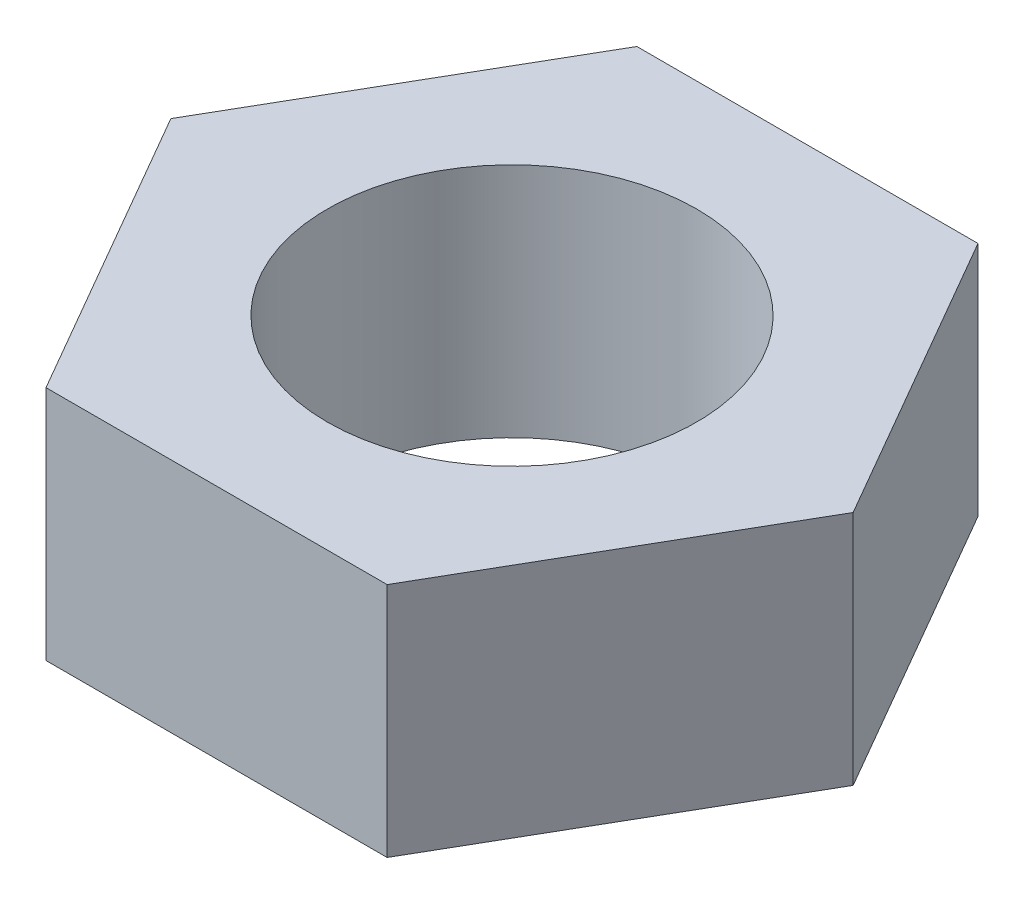
ISO-10303-21;
HEADER;
FILE_DESCRIPTION(('STEP AP214'),'2;1');
FILE_NAME('part.step','',(''),(''),'','','');
FILE_SCHEMA(('AUTOMOTIVE_DESIGN { 1 0 10303 214 1 1 1 1 }'));
ENDSEC;
DATA;
#1=APPLICATION_CONTEXT('core data for automotive mechanical design processes');
#2=APPLICATION_PROTOCOL_DEFINITION('international standard','automotive_design',2000,#1);
#3=PRODUCT_CONTEXT('',#1,'mechanical');
#4=PRODUCT('Part','Part','',(#3));
#5=PRODUCT_RELATED_PRODUCT_CATEGORY('part','',(#4));
#6=PRODUCT_DEFINITION_FORMATION('','',#4);
#7=PRODUCT_DEFINITION_CONTEXT('part definition',#1,'design');
#8=PRODUCT_DEFINITION('design','',#6,#7);
#9=PRODUCT_DEFINITION_SHAPE('','',#8);
#10=(LENGTH_UNIT() NAMED_UNIT(*) SI_UNIT(.MILLI.,.METRE.));
#11=(NAMED_UNIT(*) PLANE_ANGLE_UNIT() SI_UNIT($,.RADIAN.));
#12=(NAMED_UNIT(*) SI_UNIT($,.STERADIAN.) SOLID_ANGLE_UNIT());
#13=UNCERTAINTY_MEASURE_WITH_UNIT(LENGTH_MEASURE(1.E-05),#10,'distance_accuracy_value','');
#14=(GEOMETRIC_REPRESENTATION_CONTEXT(3) GLOBAL_UNCERTAINTY_ASSIGNED_CONTEXT((#13)) GLOBAL_UNIT_ASSIGNED_CONTEXT((#10,
#11,#12)) REPRESENTATION_CONTEXT('',''));
#15=CARTESIAN_POINT('',(0.,0.,0.));
#16=DIRECTION('',(0.,0.,1.));
#17=DIRECTION('',(1.,0.,0.));
#18=AXIS2_PLACEMENT_3D('',#15,#16,#17);
#19=CARTESIAN_POINT('',(-1.15470053837925,1.6,-2.));
#20=DIRECTION('',(0.866025403784439,0.,0.5));
#21=DIRECTION('',(0.5,0.,-0.866025403784439));
#22=AXIS2_PLACEMENT_3D('',#19,#20,#21);
#23=PLANE('',#22);
#24=DIRECTION('',(-0.5,0.,0.866025403784439));
#25=VECTOR('',#24,1.);
#26=CARTESIAN_POINT('',(-1.15470053837925,0.,-2.));
#27=LINE('',#26,#25);
#28=CARTESIAN_POINT('',(-1.15470053837925,0.,-2.));
#29=VERTEX_POINT('',#28);
#30=CARTESIAN_POINT('',(-2.3094010767585,0.,0.));
#31=VERTEX_POINT('',#30);
#32=EDGE_CURVE('E122',#29,#31,#27,.T.);
#33=ORIENTED_EDGE('',*,*,#32,.T.);
#34=DIRECTION('',(0.,-1.,0.));
#35=VECTOR('',#34,1.);
#36=CARTESIAN_POINT('',(-2.3094010767585,1.6,0.));
#37=LINE('',#36,#35);
#38=CARTESIAN_POINT('',(-2.3094010767585,1.6,0.));
#39=VERTEX_POINT('',#38);
#40=EDGE_CURVE('E11',#39,#31,#37,.T.);
#41=ORIENTED_EDGE('',*,*,#40,.F.);
#42=DIRECTION('',(-0.5,0.,0.866025403784439));
#43=VECTOR('',#42,1.);
#44=CARTESIAN_POINT('',(-1.15470053837925,1.6,-2.));
#45=LINE('',#44,#43);
#46=CARTESIAN_POINT('',(-1.15470053837925,1.6,-2.));
#47=VERTEX_POINT('',#46);
#48=EDGE_CURVE('E132',#47,#39,#45,.T.);
#49=ORIENTED_EDGE('',*,*,#48,.F.);
#50=DIRECTION('',(0.,-1.,0.));
#51=VECTOR('',#50,1.);
#52=CARTESIAN_POINT('',(-1.15470053837925,1.6,-2.));
#53=LINE('',#52,#51);
#54=EDGE_CURVE('E118',#47,#29,#53,.T.);
#55=ORIENTED_EDGE('',*,*,#54,.T.);
#56=EDGE_LOOP('',(#33,#41,#49,#55));
#57=FACE_BOUND('',#56,.T.);
#58=ADVANCED_FACE('F37',(#57),#23,.F.);
#59=CARTESIAN_POINT('',(-2.3094010767585,1.6,0.));
#60=DIRECTION('',(0.866025403784439,0.,-0.5));
#61=DIRECTION('',(-0.5,0.,-0.866025403784439));
#62=AXIS2_PLACEMENT_3D('',#59,#60,#61);
#63=PLANE('',#62);
#64=DIRECTION('',(0.5,0.,0.866025403784439));
#65=VECTOR('',#64,1.);
#66=CARTESIAN_POINT('',(-2.3094010767585,0.,0.));
#67=LINE('',#66,#65);
#68=CARTESIAN_POINT('',(-1.15470053837925,0.,2.));
#69=VERTEX_POINT('',#68);
#70=EDGE_CURVE('E125',#31,#69,#67,.T.);
#71=ORIENTED_EDGE('',*,*,#70,.T.);
#72=DIRECTION('',(0.,-1.,0.));
#73=VECTOR('',#72,1.);
#74=CARTESIAN_POINT('',(-1.15470053837925,1.6,2.));
#75=LINE('',#74,#73);
#76=CARTESIAN_POINT('',(-1.15470053837925,1.6,2.));
#77=VERTEX_POINT('',#76);
#78=EDGE_CURVE('E46',#77,#69,#75,.T.);
#79=ORIENTED_EDGE('',*,*,#78,.F.);
#80=DIRECTION('',(0.5,0.,0.866025403784439));
#81=VECTOR('',#80,1.);
#82=CARTESIAN_POINT('',(-2.3094010767585,1.6,0.));
#83=LINE('',#82,#81);
#84=EDGE_CURVE('E91',#39,#77,#83,.T.);
#85=ORIENTED_EDGE('',*,*,#84,.F.);
#86=ORIENTED_EDGE('',*,*,#40,.T.);
#87=EDGE_LOOP('',(#71,#79,#85,#86));
#88=FACE_BOUND('',#87,.T.);
#89=ADVANCED_FACE('F158',(#88),#63,.F.);
#90=CARTESIAN_POINT('',(-1.15470053837925,1.6,2.));
#91=DIRECTION('',(0.,0.,-1.));
#92=DIRECTION('',(-1.,0.,0.));
#93=AXIS2_PLACEMENT_3D('',#90,#91,#92);
#94=PLANE('',#93);
#95=DIRECTION('',(1.,0.,0.));
#96=VECTOR('',#95,1.);
#97=CARTESIAN_POINT('',(-1.15470053837925,0.,2.));
#98=LINE('',#97,#96);
#99=CARTESIAN_POINT('',(1.15470053837925,0.,2.));
#100=VERTEX_POINT('',#99);
#101=EDGE_CURVE('E127',#69,#100,#98,.T.);
#102=ORIENTED_EDGE('',*,*,#101,.T.);
#103=DIRECTION('',(0.,-1.,0.));
#104=VECTOR('',#103,1.);
#105=CARTESIAN_POINT('',(1.15470053837925,1.6,2.));
#106=LINE('',#105,#104);
#107=CARTESIAN_POINT('',(1.15470053837925,1.6,2.));
#108=VERTEX_POINT('',#107);
#109=EDGE_CURVE('E113',#108,#100,#106,.T.);
#110=ORIENTED_EDGE('',*,*,#109,.F.);
#111=DIRECTION('',(1.,0.,0.));
#112=VECTOR('',#111,1.);
#113=CARTESIAN_POINT('',(-1.15470053837925,1.6,2.));
#114=LINE('',#113,#112);
#115=EDGE_CURVE('E104',#77,#108,#114,.T.);
#116=ORIENTED_EDGE('',*,*,#115,.F.);
#117=ORIENTED_EDGE('',*,*,#78,.T.);
#118=EDGE_LOOP('',(#102,#110,#116,#117));
#119=FACE_BOUND('',#118,.T.);
#120=ADVANCED_FACE('F139',(#119),#94,.F.);
#121=CARTESIAN_POINT('',(1.15470053837925,1.6,2.));
#122=DIRECTION('',(-0.866025403784439,0.,-0.5));
#123=DIRECTION('',(-0.5,0.,0.866025403784439));
#124=AXIS2_PLACEMENT_3D('',#121,#122,#123);
#125=PLANE('',#124);
#126=DIRECTION('',(0.5,0.,-0.866025403784439));
#127=VECTOR('',#126,1.);
#128=CARTESIAN_POINT('',(1.15470053837925,0.,2.));
#129=LINE('',#128,#127);
#130=CARTESIAN_POINT('',(2.3094010767585,0.,0.));
#131=VERTEX_POINT('',#130);
#132=EDGE_CURVE('E112',#100,#131,#129,.T.);
#133=ORIENTED_EDGE('',*,*,#132,.T.);
#134=DIRECTION('',(0.,-1.,0.));
#135=VECTOR('',#134,1.);
#136=CARTESIAN_POINT('',(2.3094010767585,1.6,0.));
#137=LINE('',#136,#135);
#138=CARTESIAN_POINT('',(2.3094010767585,1.6,0.));
#139=VERTEX_POINT('',#138);
#140=EDGE_CURVE('E109',#139,#131,#137,.T.);
#141=ORIENTED_EDGE('',*,*,#140,.F.);
#142=DIRECTION('',(0.5,0.,-0.866025403784439));
#143=VECTOR('',#142,1.);
#144=CARTESIAN_POINT('',(1.15470053837925,1.6,2.));
#145=LINE('',#144,#143);
#146=EDGE_CURVE('E98',#108,#139,#145,.T.);
#147=ORIENTED_EDGE('',*,*,#146,.F.);
#148=ORIENTED_EDGE('',*,*,#109,.T.);
#149=EDGE_LOOP('',(#133,#141,#147,#148));
#150=FACE_BOUND('',#149,.T.);
#151=ADVANCED_FACE('F110',(#150),#125,.F.);
#152=CARTESIAN_POINT('',(2.3094010767585,1.6,0.));
#153=DIRECTION('',(-0.866025403784438,0.,0.5));
#154=DIRECTION('',(0.5,0.,0.866025403784438));
#155=AXIS2_PLACEMENT_3D('',#152,#153,#154);
#156=PLANE('',#155);
#157=DIRECTION('',(-0.5,0.,-0.866025403784438));
#158=VECTOR('',#157,1.);
#159=CARTESIAN_POINT('',(2.3094010767585,0.,0.));
#160=LINE('',#159,#158);
#161=CARTESIAN_POINT('',(1.15470053837925,0.,-2.));
#162=VERTEX_POINT('',#161);
#163=EDGE_CURVE('E77',#131,#162,#160,.T.);
#164=ORIENTED_EDGE('',*,*,#163,.T.);
#165=DIRECTION('',(0.,-1.,0.));
#166=VECTOR('',#165,1.);
#167=CARTESIAN_POINT('',(1.15470053837925,1.6,-2.));
#168=LINE('',#167,#166);
#169=CARTESIAN_POINT('',(1.15470053837925,1.6,-2.));
#170=VERTEX_POINT('',#169);
#171=EDGE_CURVE('E114',#170,#162,#168,.T.);
#172=ORIENTED_EDGE('',*,*,#171,.F.);
#173=DIRECTION('',(-0.5,0.,-0.866025403784438));
#174=VECTOR('',#173,1.);
#175=CARTESIAN_POINT('',(2.3094010767585,1.6,0.));
#176=LINE('',#175,#174);
#177=EDGE_CURVE('E102',#139,#170,#176,.T.);
#178=ORIENTED_EDGE('',*,*,#177,.F.);
#179=ORIENTED_EDGE('',*,*,#140,.T.);
#180=EDGE_LOOP('',(#164,#172,#178,#179));
#181=FACE_BOUND('',#180,.T.);
#182=ADVANCED_FACE('F116',(#181),#156,.F.);
#183=CARTESIAN_POINT('',(1.15470053837925,1.6,-2.));
#184=DIRECTION('',(0.,0.,1.));
#185=DIRECTION('',(1.,0.,0.));
#186=AXIS2_PLACEMENT_3D('',#183,#184,#185);
#187=PLANE('',#186);
#188=DIRECTION('',(-1.,0.,0.));
#189=VECTOR('',#188,1.);
#190=CARTESIAN_POINT('',(1.15470053837925,0.,-2.));
#191=LINE('',#190,#189);
#192=EDGE_CURVE('E83',#162,#29,#191,.T.);
#193=ORIENTED_EDGE('',*,*,#192,.T.);
#194=ORIENTED_EDGE('',*,*,#54,.F.);
#195=DIRECTION('',(-1.,0.,0.));
#196=VECTOR('',#195,1.);
#197=CARTESIAN_POINT('',(1.15470053837925,1.6,-2.));
#198=LINE('',#197,#196);
#199=EDGE_CURVE('E54',#170,#47,#198,.T.);
#200=ORIENTED_EDGE('',*,*,#199,.F.);
#201=ORIENTED_EDGE('',*,*,#171,.T.);
#202=EDGE_LOOP('',(#193,#194,#200,#201));
#203=FACE_BOUND('',#202,.T.);
#204=ADVANCED_FACE('F146',(#203),#187,.F.);
#205=CARTESIAN_POINT('',(0.,1.6,0.));
#206=DIRECTION('',(0.,1.,0.));
#207=DIRECTION('',(0.,0.,1.));
#208=AXIS2_PLACEMENT_3D('',#205,#206,#207);
#209=PLANE('',#208);
#210=CARTESIAN_POINT('',(0.,1.6,0.));
#211=DIRECTION('',(0.,1.,0.));
#212=DIRECTION('',(0.,0.,1.));
#213=AXIS2_PLACEMENT_3D('',#210,#211,#212);
#214=CIRCLE('',#213,1.25);
#215=CARTESIAN_POINT('',(0.,1.6,1.25));
#216=VERTEX_POINT('',#215);
#217=EDGE_CURVE('E213',#216,#216,#214,.T.);
#218=ORIENTED_EDGE('',*,*,#217,.F.);
#219=EDGE_LOOP('',(#218));
#220=FACE_BOUND('',#219,.T.);
#221=ORIENTED_EDGE('',*,*,#48,.T.);
#222=ORIENTED_EDGE('',*,*,#84,.T.);
#223=ORIENTED_EDGE('',*,*,#115,.T.);
#224=ORIENTED_EDGE('',*,*,#146,.T.);
#225=ORIENTED_EDGE('',*,*,#177,.T.);
#226=ORIENTED_EDGE('',*,*,#199,.T.);
#227=EDGE_LOOP('',(#221,#222,#223,#224,#225,#226));
#228=FACE_BOUND('',#227,.T.);
#229=ADVANCED_FACE('F100',(#220,#228),#209,.T.);
#230=CARTESIAN_POINT('',(0.,0.,0.));
#231=DIRECTION('',(0.,1.,0.));
#232=DIRECTION('',(0.,0.,1.));
#233=AXIS2_PLACEMENT_3D('',#230,#231,#232);
#234=PLANE('',#233);
#235=CARTESIAN_POINT('',(0.,0.,0.));
#236=DIRECTION('',(0.,1.,0.));
#237=DIRECTION('',(0.,0.,1.));
#238=AXIS2_PLACEMENT_3D('',#235,#236,#237);
#239=CIRCLE('',#238,1.25);
#240=CARTESIAN_POINT('',(0.,0.,1.25));
#241=VERTEX_POINT('',#240);
#242=EDGE_CURVE('E40',#241,#241,#239,.T.);
#243=ORIENTED_EDGE('',*,*,#242,.T.);
#244=EDGE_LOOP('',(#243));
#245=FACE_BOUND('',#244,.T.);
#246=ORIENTED_EDGE('',*,*,#32,.F.);
#247=ORIENTED_EDGE('',*,*,#192,.F.);
#248=ORIENTED_EDGE('',*,*,#163,.F.);
#249=ORIENTED_EDGE('',*,*,#132,.F.);
#250=ORIENTED_EDGE('',*,*,#101,.F.);
#251=ORIENTED_EDGE('',*,*,#70,.F.);
#252=EDGE_LOOP('',(#246,#247,#248,#249,#250,#251));
#253=FACE_BOUND('',#252,.T.);
#254=ADVANCED_FACE('F142',(#245,#253),#234,.F.);
#255=CARTESIAN_POINT('',(0.,-0.8,0.));
#256=DIRECTION('',(0.,1.,0.));
#257=DIRECTION('',(0.,0.,1.));
#258=AXIS2_PLACEMENT_3D('',#255,#256,#257);
#259=CYLINDRICAL_SURFACE('',#258,1.25);
#260=ORIENTED_EDGE('',*,*,#217,.T.);
#261=EDGE_LOOP('',(#260));
#262=FACE_BOUND('',#261,.T.);
#263=ORIENTED_EDGE('',*,*,#242,.F.);
#264=EDGE_LOOP('',(#263));
#265=FACE_BOUND('',#264,.T.);
#266=ADVANCED_FACE('F195',(#262,#265),#259,.F.);
#267=CLOSED_SHELL('',(#58,#89,#120,#151,#182,#204,#229,#254,#266));
#268=MANIFOLD_SOLID_BREP('B2',#267);
#269=ADVANCED_BREP_SHAPE_REPRESENTATION('',(#18,#268),#14);
#270=SHAPE_DEFINITION_REPRESENTATION(#9,#269);
ENDSEC;
END-ISO-10303-21;
